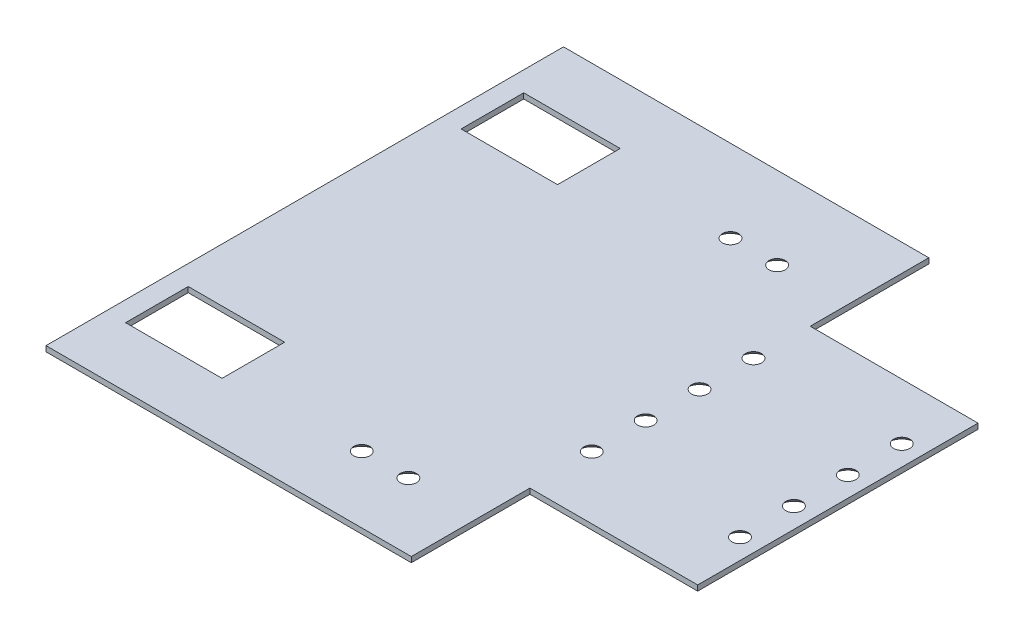
ISO-10303-21;
HEADER;
FILE_DESCRIPTION(('STEP AP214'),'2;1');
FILE_NAME('part.step','',(''),(''),'','','');
FILE_SCHEMA(('AUTOMOTIVE_DESIGN { 1 0 10303 214 1 1 1 1 }'));
ENDSEC;
DATA;
#1=APPLICATION_CONTEXT('core data for automotive mechanical design processes');
#2=APPLICATION_PROTOCOL_DEFINITION('international standard','automotive_design',2000,#1);
#3=PRODUCT_CONTEXT('',#1,'mechanical');
#4=PRODUCT('Part','Part','',(#3));
#5=PRODUCT_RELATED_PRODUCT_CATEGORY('part','',(#4));
#6=PRODUCT_DEFINITION_FORMATION('','',#4);
#7=PRODUCT_DEFINITION_CONTEXT('part definition',#1,'design');
#8=PRODUCT_DEFINITION('design','',#6,#7);
#9=PRODUCT_DEFINITION_SHAPE('','',#8);
#10=(LENGTH_UNIT() NAMED_UNIT(*) SI_UNIT(.MILLI.,.METRE.));
#11=(NAMED_UNIT(*) PLANE_ANGLE_UNIT() SI_UNIT($,.RADIAN.));
#12=(NAMED_UNIT(*) SI_UNIT($,.STERADIAN.) SOLID_ANGLE_UNIT());
#13=UNCERTAINTY_MEASURE_WITH_UNIT(LENGTH_MEASURE(1.E-05),#10,'distance_accuracy_value','');
#14=(GEOMETRIC_REPRESENTATION_CONTEXT(3) GLOBAL_UNCERTAINTY_ASSIGNED_CONTEXT((#13)) GLOBAL_UNIT_ASSIGNED_CONTEXT((#10,
#11,#12)) REPRESENTATION_CONTEXT('',''));
#15=CARTESIAN_POINT('',(0.,0.,0.));
#16=DIRECTION('',(0.,0.,1.));
#17=DIRECTION('',(1.,0.,0.));
#18=AXIS2_PLACEMENT_3D('',#15,#16,#17);
#19=CARTESIAN_POINT('',(0.,1.,0.));
#20=DIRECTION('',(0.,-1.,0.));
#21=DIRECTION('',(0.,0.,-1.));
#22=AXIS2_PLACEMENT_3D('',#19,#20,#21);
#23=PLANE('',#22);
#24=CARTESIAN_POINT('',(5.92356900920418,1.,35.6602207894241));
#25=DIRECTION('',(0.,1.,0.));
#26=DIRECTION('',(0.,0.,1.));
#27=AXIS2_PLACEMENT_3D('',#24,#25,#26);
#28=CIRCLE('',#27,1.5);
#29=CARTESIAN_POINT('',(5.92356900920418,1.,37.1602207894241));
#30=VERTEX_POINT('',#29);
#31=EDGE_CURVE('E320',#30,#30,#28,.T.);
#32=ORIENTED_EDGE('',*,*,#31,.F.);
#33=EDGE_LOOP('',(#32));
#34=FACE_BOUND('',#33,.T.);
#35=CARTESIAN_POINT('',(-2.72643099079582,1.,35.6602207894241));
#36=DIRECTION('',(0.,1.,0.));
#37=DIRECTION('',(0.,0.,1.));
#38=AXIS2_PLACEMENT_3D('',#35,#36,#37);
#39=CIRCLE('',#38,1.5);
#40=CARTESIAN_POINT('',(-2.72643099079582,1.,37.1602207894241));
#41=VERTEX_POINT('',#40);
#42=EDGE_CURVE('E322',#41,#41,#39,.T.);
#43=ORIENTED_EDGE('',*,*,#42,.F.);
#44=EDGE_LOOP('',(#43));
#45=FACE_BOUND('',#44,.T.);
#46=CARTESIAN_POINT('',(-2.72643099079582,1.,-32.7469767878305));
#47=DIRECTION('',(0.,1.,0.));
#48=DIRECTION('',(0.,0.,1.));
#49=AXIS2_PLACEMENT_3D('',#46,#47,#48);
#50=CIRCLE('',#49,1.5);
#51=CARTESIAN_POINT('',(-2.72643099079582,1.,-31.2469767878306));
#52=VERTEX_POINT('',#51);
#53=EDGE_CURVE('E325',#52,#52,#50,.T.);
#54=ORIENTED_EDGE('',*,*,#53,.F.);
#55=EDGE_LOOP('',(#54));
#56=FACE_BOUND('',#55,.T.);
#57=CARTESIAN_POINT('',(5.92356900920418,1.,-32.7469767878305));
#58=DIRECTION('',(0.,1.,0.));
#59=DIRECTION('',(0.,0.,1.));
#60=AXIS2_PLACEMENT_3D('',#57,#58,#59);
#61=CIRCLE('',#60,1.5);
#62=CARTESIAN_POINT('',(5.92356900920418,1.,-31.2469767878306));
#63=VERTEX_POINT('',#62);
#64=EDGE_CURVE('E329',#63,#63,#61,.T.);
#65=ORIENTED_EDGE('',*,*,#64,.F.);
#66=EDGE_LOOP('',(#65));
#67=FACE_BOUND('',#66,.T.);
#68=CARTESIAN_POINT('',(46.1837979810975,1.,-5.59999999995909));
#69=DIRECTION('',(0.,1.,0.));
#70=DIRECTION('',(0.,0.,1.));
#71=AXIS2_PLACEMENT_3D('',#68,#69,#70);
#72=CIRCLE('',#71,1.50000000001881);
#73=CARTESIAN_POINT('',(46.1837979810975,1.,-4.09999999994028));
#74=VERTEX_POINT('',#73);
#75=EDGE_CURVE('E339',#74,#74,#72,.T.);
#76=ORIENTED_EDGE('',*,*,#75,.F.);
#77=EDGE_LOOP('',(#76));
#78=FACE_BOUND('',#77,.T.);
#79=CARTESIAN_POINT('',(18.6837979810975,1.,4.40000000004091));
#80=DIRECTION('',(0.,1.,0.));
#81=DIRECTION('',(0.,0.,1.));
#82=AXIS2_PLACEMENT_3D('',#79,#80,#81);
#83=CIRCLE('',#82,1.50000000001833);
#84=CARTESIAN_POINT('',(18.6837979810975,1.,5.90000000005924));
#85=VERTEX_POINT('',#84);
#86=EDGE_CURVE('E342',#85,#85,#83,.T.);
#87=ORIENTED_EDGE('',*,*,#86,.F.);
#88=EDGE_LOOP('',(#87));
#89=FACE_BOUND('',#88,.T.);
#90=CARTESIAN_POINT('',(46.1837979810975,1.,4.40000000004091));
#91=DIRECTION('',(0.,1.,0.));
#92=DIRECTION('',(0.,0.,1.));
#93=AXIS2_PLACEMENT_3D('',#90,#91,#92);
#94=CIRCLE('',#93,1.50000000001881);
#95=CARTESIAN_POINT('',(46.1837979810975,1.,5.90000000005972));
#96=VERTEX_POINT('',#95);
#97=EDGE_CURVE('E345',#96,#96,#94,.T.);
#98=ORIENTED_EDGE('',*,*,#97,.F.);
#99=EDGE_LOOP('',(#98));
#100=FACE_BOUND('',#99,.T.);
#101=CARTESIAN_POINT('',(18.6837979810975,1.,14.4000000000409));
#102=DIRECTION('',(0.,1.,0.));
#103=DIRECTION('',(0.,0.,1.));
#104=AXIS2_PLACEMENT_3D('',#101,#102,#103);
#105=CIRCLE('',#104,1.50000000001833);
#106=CARTESIAN_POINT('',(18.6837979810975,1.,15.9000000000592));
#107=VERTEX_POINT('',#106);
#108=EDGE_CURVE('E348',#107,#107,#105,.T.);
#109=ORIENTED_EDGE('',*,*,#108,.F.);
#110=EDGE_LOOP('',(#109));
#111=FACE_BOUND('',#110,.T.);
#112=CARTESIAN_POINT('',(18.6837979810974,1.,-15.5999999999591));
#113=DIRECTION('',(0.,1.,0.));
#114=DIRECTION('',(0.,0.,1.));
#115=AXIS2_PLACEMENT_3D('',#112,#113,#114);
#116=CIRCLE('',#115,1.50000000001833);
#117=CARTESIAN_POINT('',(18.6837979810974,1.,-14.0999999999408));
#118=VERTEX_POINT('',#117);
#119=EDGE_CURVE('E332',#118,#118,#116,.T.);
#120=ORIENTED_EDGE('',*,*,#119,.F.);
#121=EDGE_LOOP('',(#120));
#122=FACE_BOUND('',#121,.T.);
#123=CARTESIAN_POINT('',(46.1837979810974,1.,-15.5999999999591));
#124=DIRECTION('',(0.,1.,0.));
#125=DIRECTION('',(0.,0.,1.));
#126=AXIS2_PLACEMENT_3D('',#123,#124,#125);
#127=CIRCLE('',#126,1.50000000001881);
#128=CARTESIAN_POINT('',(46.1837979810974,1.,-14.0999999999403));
#129=VERTEX_POINT('',#128);
#130=EDGE_CURVE('E335',#129,#129,#127,.T.);
#131=ORIENTED_EDGE('',*,*,#130,.F.);
#132=EDGE_LOOP('',(#131));
#133=FACE_BOUND('',#132,.T.);
#134=CARTESIAN_POINT('',(18.6837979810975,1.,-5.59999999995909));
#135=DIRECTION('',(0.,1.,0.));
#136=DIRECTION('',(0.,0.,1.));
#137=AXIS2_PLACEMENT_3D('',#134,#135,#136);
#138=CIRCLE('',#137,1.50000000001833);
#139=CARTESIAN_POINT('',(18.6837979810975,1.,-4.09999999994076));
#140=VERTEX_POINT('',#139);
#141=EDGE_CURVE('E336',#140,#140,#138,.T.);
#142=ORIENTED_EDGE('',*,*,#141,.F.);
#143=EDGE_LOOP('',(#142));
#144=FACE_BOUND('',#143,.T.);
#145=CARTESIAN_POINT('',(46.1837979810975,1.,14.4000000000409));
#146=DIRECTION('',(0.,1.,0.));
#147=DIRECTION('',(0.,0.,1.));
#148=AXIS2_PLACEMENT_3D('',#145,#146,#147);
#149=CIRCLE('',#148,1.50000000001881);
#150=CARTESIAN_POINT('',(46.1837979810975,1.,15.9000000000597));
#151=VERTEX_POINT('',#150);
#152=EDGE_CURVE('E179',#151,#151,#149,.T.);
#153=ORIENTED_EDGE('',*,*,#152,.F.);
#154=EDGE_LOOP('',(#153));
#155=FACE_BOUND('',#154,.T.);
#156=DIRECTION('',(0.,0.,1.));
#157=VECTOR('',#156,1.);
#158=CARTESIAN_POINT('',(-45.2655887180152,1.,-36.9305061843001));
#159=LINE('',#158,#157);
#160=CARTESIAN_POINT('',(-45.2655887180152,1.,-36.9305061843001));
#161=VERTEX_POINT('',#160);
#162=CARTESIAN_POINT('',(-45.2655887180152,1.,-25.3095235954431));
#163=VERTEX_POINT('',#162);
#164=EDGE_CURVE('E189',#161,#163,#159,.T.);
#165=ORIENTED_EDGE('',*,*,#164,.F.);
#166=DIRECTION('',(-1.,0.,0.));
#167=VECTOR('',#166,1.);
#168=CARTESIAN_POINT('',(-45.2655887180152,1.,-36.9305061843001));
#169=LINE('',#168,#167);
#170=CARTESIAN_POINT('',(-27.3725872945403,1.,-36.9305061843001));
#171=VERTEX_POINT('',#170);
#172=EDGE_CURVE('E197',#171,#161,#169,.T.);
#173=ORIENTED_EDGE('',*,*,#172,.F.);
#174=DIRECTION('',(0.,0.,-1.));
#175=VECTOR('',#174,1.);
#176=CARTESIAN_POINT('',(-27.3725872945403,1.,-36.9305061843001));
#177=LINE('',#176,#175);
#178=CARTESIAN_POINT('',(-27.3725872945403,1.,-25.3095235954431));
#179=VERTEX_POINT('',#178);
#180=EDGE_CURVE('E194',#179,#171,#177,.T.);
#181=ORIENTED_EDGE('',*,*,#180,.F.);
#182=DIRECTION('',(1.,0.,0.));
#183=VECTOR('',#182,1.);
#184=CARTESIAN_POINT('',(-45.2655887180152,1.,-25.3095235954431));
#185=LINE('',#184,#183);
#186=EDGE_CURVE('E191',#163,#179,#185,.T.);
#187=ORIENTED_EDGE('',*,*,#186,.F.);
#188=EDGE_LOOP('',(#165,#173,#181,#187));
#189=FACE_BOUND('',#188,.T.);
#190=DIRECTION('',(1.,0.,1.61649475190916E-13));
#191=VECTOR('',#190,1.);
#192=CARTESIAN_POINT('',(-48.9590812442226,1.,48.000000000031));
#193=LINE('',#192,#191);
#194=CARTESIAN_POINT('',(-48.9590812442226,1.,48.000000000031));
#195=VERTEX_POINT('',#194);
#196=CARTESIAN_POINT('',(18.8099324408469,1.,48.0000000000413));
#197=VERTEX_POINT('',#196);
#198=EDGE_CURVE('E220',#195,#197,#193,.T.);
#199=ORIENTED_EDGE('',*,*,#198,.T.);
#200=DIRECTION('',(0.,0.,-1.));
#201=VECTOR('',#200,1.);
#202=CARTESIAN_POINT('',(18.8099324408469,1.,26.000000000031));
#203=LINE('',#202,#201);
#204=CARTESIAN_POINT('',(18.8099324408469,1.,26.000000000031));
#205=VERTEX_POINT('',#204);
#206=EDGE_CURVE('E222',#197,#205,#203,.T.);
#207=ORIENTED_EDGE('',*,*,#206,.T.);
#208=DIRECTION('',(1.,0.,0.));
#209=VECTOR('',#208,1.);
#210=CARTESIAN_POINT('',(49.9337979810974,1.,26.000000000031));
#211=LINE('',#210,#209);
#212=CARTESIAN_POINT('',(49.9337979810974,1.,26.000000000031));
#213=VERTEX_POINT('',#212);
#214=EDGE_CURVE('E225',#205,#213,#211,.T.);
#215=ORIENTED_EDGE('',*,*,#214,.T.);
#216=DIRECTION('',(0.,0.,-1.));
#217=VECTOR('',#216,1.);
#218=CARTESIAN_POINT('',(49.9337979810974,1.,-25.9999999999587));
#219=LINE('',#218,#217);
#220=CARTESIAN_POINT('',(49.9337979810974,1.,-25.9999999999587));
#221=VERTEX_POINT('',#220);
#222=EDGE_CURVE('E227',#213,#221,#219,.T.);
#223=ORIENTED_EDGE('',*,*,#222,.T.);
#224=DIRECTION('',(-1.,0.,0.));
#225=VECTOR('',#224,1.);
#226=CARTESIAN_POINT('',(49.9337979810974,1.,-25.9999999999587));
#227=LINE('',#226,#225);
#228=CARTESIAN_POINT('',(18.8099324408469,1.,-25.9999999999587));
#229=VERTEX_POINT('',#228);
#230=EDGE_CURVE('E229',#221,#229,#227,.T.);
#231=ORIENTED_EDGE('',*,*,#230,.T.);
#232=DIRECTION('',(0.,0.,-1.));
#233=VECTOR('',#232,1.);
#234=CARTESIAN_POINT('',(18.8099324408469,1.,-25.9999999999587));
#235=LINE('',#234,#233);
#236=CARTESIAN_POINT('',(18.8099324408469,1.,-47.999999999969));
#237=VERTEX_POINT('',#236);
#238=EDGE_CURVE('E231',#229,#237,#235,.T.);
#239=ORIENTED_EDGE('',*,*,#238,.T.);
#240=DIRECTION('',(-1.,0.,0.));
#241=VECTOR('',#240,1.);
#242=CARTESIAN_POINT('',(15.,1.,-47.999999999969));
#243=LINE('',#242,#241);
#244=CARTESIAN_POINT('',(-48.9590812442226,1.,-47.9999999999586));
#245=VERTEX_POINT('',#244);
#246=EDGE_CURVE('E233',#237,#245,#243,.T.);
#247=ORIENTED_EDGE('',*,*,#246,.T.);
#248=DIRECTION('',(0.,0.,1.));
#249=VECTOR('',#248,1.);
#250=CARTESIAN_POINT('',(-48.9590812442226,1.,-47.9999999999586));
#251=LINE('',#250,#249);
#252=EDGE_CURVE('E235',#245,#195,#251,.T.);
#253=ORIENTED_EDGE('',*,*,#252,.T.);
#254=EDGE_LOOP('',(#199,#207,#215,#223,#231,#239,#247,#253));
#255=FACE_BOUND('',#254,.T.);
#256=DIRECTION('',(1.,0.,0.));
#257=VECTOR('',#256,1.);
#258=CARTESIAN_POINT('',(-45.2655887180152,1.,36.9305061843724));
#259=LINE('',#258,#257);
#260=CARTESIAN_POINT('',(-45.2655887180152,1.,36.9305061843724));
#261=VERTEX_POINT('',#260);
#262=CARTESIAN_POINT('',(-27.3725872945403,1.,36.9305061843724));
#263=VERTEX_POINT('',#262);
#264=EDGE_CURVE('E151',#261,#263,#259,.T.);
#265=ORIENTED_EDGE('',*,*,#264,.F.);
#266=DIRECTION('',(0.,0.,1.));
#267=VECTOR('',#266,1.);
#268=CARTESIAN_POINT('',(-45.2655887180152,1.,36.9305061843724));
#269=LINE('',#268,#267);
#270=CARTESIAN_POINT('',(-45.2655887180152,1.,25.3095235955155));
#271=VERTEX_POINT('',#270);
#272=EDGE_CURVE('E173',#271,#261,#269,.T.);
#273=ORIENTED_EDGE('',*,*,#272,.F.);
#274=DIRECTION('',(-1.,0.,0.));
#275=VECTOR('',#274,1.);
#276=CARTESIAN_POINT('',(-45.2655887180152,1.,25.3095235955155));
#277=LINE('',#276,#275);
#278=CARTESIAN_POINT('',(-27.3725872945403,1.,25.3095235955155));
#279=VERTEX_POINT('',#278);
#280=EDGE_CURVE('E171',#279,#271,#277,.T.);
#281=ORIENTED_EDGE('',*,*,#280,.F.);
#282=DIRECTION('',(0.,0.,-1.));
#283=VECTOR('',#282,1.);
#284=CARTESIAN_POINT('',(-27.3725872945403,1.,36.9305061843724));
#285=LINE('',#284,#283);
#286=EDGE_CURVE('E159',#263,#279,#285,.T.);
#287=ORIENTED_EDGE('',*,*,#286,.F.);
#288=EDGE_LOOP('',(#265,#273,#281,#287));
#289=FACE_BOUND('',#288,.T.);
#290=ADVANCED_FACE('F37',(#34,#45,#56,#67,#78,#89,#100,#111,#122,#133,#144,#155,#189,#255,#289),
#23,.F.);
#291=CARTESIAN_POINT('',(0.,0.,0.));
#292=DIRECTION('',(0.,-1.,0.));
#293=DIRECTION('',(0.,0.,-1.));
#294=AXIS2_PLACEMENT_3D('',#291,#292,#293);
#295=PLANE('',#294);
#296=CARTESIAN_POINT('',(-2.72643099079582,0.,35.6602207894241));
#297=DIRECTION('',(0.,-1.,0.));
#298=DIRECTION('',(0.,0.,-1.));
#299=AXIS2_PLACEMENT_3D('',#296,#297,#298);
#300=CIRCLE('',#299,2.50000000000002);
#301=CARTESIAN_POINT('',(-2.72643099079582,0.,33.1602207894241));
#302=VERTEX_POINT('',#301);
#303=EDGE_CURVE('E11',#302,#302,#300,.F.);
#304=ORIENTED_EDGE('',*,*,#303,.T.);
#305=EDGE_LOOP('',(#304));
#306=FACE_BOUND('',#305,.T.);
#307=CARTESIAN_POINT('',(5.92356900920418,0.,35.6602207894241));
#308=DIRECTION('',(0.,-1.,0.));
#309=DIRECTION('',(0.,0.,-1.));
#310=AXIS2_PLACEMENT_3D('',#307,#308,#309);
#311=CIRCLE('',#310,2.50000000000002);
#312=CARTESIAN_POINT('',(5.92356900920418,0.,33.1602207894241));
#313=VERTEX_POINT('',#312);
#314=EDGE_CURVE('E46',#313,#313,#311,.F.);
#315=ORIENTED_EDGE('',*,*,#314,.T.);
#316=EDGE_LOOP('',(#315));
#317=FACE_BOUND('',#316,.T.);
#318=CARTESIAN_POINT('',(-2.72643099079582,0.,-32.7469767878305));
#319=DIRECTION('',(0.,-1.,0.));
#320=DIRECTION('',(0.,0.,-1.));
#321=AXIS2_PLACEMENT_3D('',#318,#319,#320);
#322=CIRCLE('',#321,2.50000000000002);
#323=CARTESIAN_POINT('',(-2.72643099079582,0.,-35.2469767878306));
#324=VERTEX_POINT('',#323);
#325=EDGE_CURVE('E304',#324,#324,#322,.F.);
#326=ORIENTED_EDGE('',*,*,#325,.T.);
#327=EDGE_LOOP('',(#326));
#328=FACE_BOUND('',#327,.T.);
#329=CARTESIAN_POINT('',(5.92356900920418,0.,-32.7469767878305));
#330=DIRECTION('',(0.,-1.,0.));
#331=DIRECTION('',(0.,0.,-1.));
#332=AXIS2_PLACEMENT_3D('',#329,#330,#331);
#333=CIRCLE('',#332,2.50000000000002);
#334=CARTESIAN_POINT('',(5.92356900920418,0.,-35.2469767878306));
#335=VERTEX_POINT('',#334);
#336=EDGE_CURVE('E301',#335,#335,#333,.F.);
#337=ORIENTED_EDGE('',*,*,#336,.T.);
#338=EDGE_LOOP('',(#337));
#339=FACE_BOUND('',#338,.T.);
#340=CARTESIAN_POINT('',(18.6837979810974,0.,-15.5999999999591));
#341=DIRECTION('',(0.,-1.,0.));
#342=DIRECTION('',(0.,0.,-1.));
#343=AXIS2_PLACEMENT_3D('',#340,#341,#342);
#344=CIRCLE('',#343,2.50000000001835);
#345=CARTESIAN_POINT('',(18.6837979810974,0.,-18.0999999999774));
#346=VERTEX_POINT('',#345);
#347=EDGE_CURVE('E298',#346,#346,#344,.F.);
#348=ORIENTED_EDGE('',*,*,#347,.T.);
#349=EDGE_LOOP('',(#348));
#350=FACE_BOUND('',#349,.T.);
#351=CARTESIAN_POINT('',(18.6837979810975,0.,-5.59999999995909));
#352=DIRECTION('',(0.,-1.,0.));
#353=DIRECTION('',(0.,0.,-1.));
#354=AXIS2_PLACEMENT_3D('',#351,#352,#353);
#355=CIRCLE('',#354,2.50000000001835);
#356=CARTESIAN_POINT('',(18.6837979810975,0.,-8.09999999997744));
#357=VERTEX_POINT('',#356);
#358=EDGE_CURVE('E295',#357,#357,#355,.F.);
#359=ORIENTED_EDGE('',*,*,#358,.T.);
#360=EDGE_LOOP('',(#359));
#361=FACE_BOUND('',#360,.T.);
#362=CARTESIAN_POINT('',(18.6837979810975,0.,4.40000000004091));
#363=DIRECTION('',(0.,-1.,0.));
#364=DIRECTION('',(0.,0.,-1.));
#365=AXIS2_PLACEMENT_3D('',#362,#363,#364);
#366=CIRCLE('',#365,2.50000000001835);
#367=CARTESIAN_POINT('',(18.6837979810975,0.,1.90000000002256));
#368=VERTEX_POINT('',#367);
#369=EDGE_CURVE('E292',#368,#368,#366,.F.);
#370=ORIENTED_EDGE('',*,*,#369,.T.);
#371=EDGE_LOOP('',(#370));
#372=FACE_BOUND('',#371,.T.);
#373=CARTESIAN_POINT('',(18.6837979810975,0.,14.4000000000409));
#374=DIRECTION('',(0.,-1.,0.));
#375=DIRECTION('',(0.,0.,-1.));
#376=AXIS2_PLACEMENT_3D('',#373,#374,#375);
#377=CIRCLE('',#376,2.50000000001835);
#378=CARTESIAN_POINT('',(18.6837979810975,0.,11.9000000000226));
#379=VERTEX_POINT('',#378);
#380=EDGE_CURVE('E289',#379,#379,#377,.F.);
#381=ORIENTED_EDGE('',*,*,#380,.T.);
#382=EDGE_LOOP('',(#381));
#383=FACE_BOUND('',#382,.T.);
#384=CARTESIAN_POINT('',(46.1837979810974,0.,-15.5999999999591));
#385=DIRECTION('',(0.,-1.,0.));
#386=DIRECTION('',(0.,0.,-1.));
#387=AXIS2_PLACEMENT_3D('',#384,#385,#386);
#388=CIRCLE('',#387,2.50000000001882);
#389=CARTESIAN_POINT('',(46.1837979810974,0.,-18.0999999999779));
#390=VERTEX_POINT('',#389);
#391=EDGE_CURVE('E286',#390,#390,#388,.F.);
#392=ORIENTED_EDGE('',*,*,#391,.T.);
#393=EDGE_LOOP('',(#392));
#394=FACE_BOUND('',#393,.T.);
#395=CARTESIAN_POINT('',(46.1837979810975,0.,-5.59999999995909));
#396=DIRECTION('',(0.,-1.,0.));
#397=DIRECTION('',(0.,0.,-1.));
#398=AXIS2_PLACEMENT_3D('',#395,#396,#397);
#399=CIRCLE('',#398,2.50000000001883);
#400=CARTESIAN_POINT('',(46.1837979810975,0.,-8.09999999997792));
#401=VERTEX_POINT('',#400);
#402=EDGE_CURVE('E283',#401,#401,#399,.F.);
#403=ORIENTED_EDGE('',*,*,#402,.T.);
#404=EDGE_LOOP('',(#403));
#405=FACE_BOUND('',#404,.T.);
#406=CARTESIAN_POINT('',(46.1837979810975,0.,4.40000000004091));
#407=DIRECTION('',(0.,-1.,0.));
#408=DIRECTION('',(0.,0.,-1.));
#409=AXIS2_PLACEMENT_3D('',#406,#407,#408);
#410=CIRCLE('',#409,2.50000000001882);
#411=CARTESIAN_POINT('',(46.1837979810975,0.,1.90000000002208));
#412=VERTEX_POINT('',#411);
#413=EDGE_CURVE('E280',#412,#412,#410,.F.);
#414=ORIENTED_EDGE('',*,*,#413,.T.);
#415=EDGE_LOOP('',(#414));
#416=FACE_BOUND('',#415,.T.);
#417=CARTESIAN_POINT('',(46.1837979810975,0.,14.4000000000409));
#418=DIRECTION('',(0.,-1.,0.));
#419=DIRECTION('',(0.,0.,-1.));
#420=AXIS2_PLACEMENT_3D('',#417,#418,#419);
#421=CIRCLE('',#420,2.50000000001882);
#422=CARTESIAN_POINT('',(46.1837979810975,0.,11.9000000000221));
#423=VERTEX_POINT('',#422);
#424=EDGE_CURVE('E277',#423,#423,#421,.F.);
#425=ORIENTED_EDGE('',*,*,#424,.T.);
#426=EDGE_LOOP('',(#425));
#427=FACE_BOUND('',#426,.T.);
#428=DIRECTION('',(1.,0.,0.));
#429=VECTOR('',#428,1.);
#430=CARTESIAN_POINT('',(15.,0.,48.0000000000413));
#431=LINE('',#430,#429);
#432=CARTESIAN_POINT('',(-48.9590812442226,0.,48.000000000031));
#433=VERTEX_POINT('',#432);
#434=CARTESIAN_POINT('',(18.8099324408469,0.,48.0000000000413));
#435=VERTEX_POINT('',#434);
#436=EDGE_CURVE('E219',#433,#435,#431,.T.);
#437=ORIENTED_EDGE('',*,*,#436,.F.);
#438=DIRECTION('',(0.,0.,1.));
#439=VECTOR('',#438,1.);
#440=CARTESIAN_POINT('',(-48.9590812442226,0.,-47.9999999999586));
#441=LINE('',#440,#439);
#442=CARTESIAN_POINT('',(-48.9590812442226,0.,-47.9999999999586));
#443=VERTEX_POINT('',#442);
#444=EDGE_CURVE('E223',#443,#433,#441,.T.);
#445=ORIENTED_EDGE('',*,*,#444,.F.);
#446=DIRECTION('',(-1.,0.,1.61866454352247E-13));
#447=VECTOR('',#446,1.);
#448=CARTESIAN_POINT('',(-48.9590812442226,0.,-47.9999999999586));
#449=LINE('',#448,#447);
#450=CARTESIAN_POINT('',(18.8099324408469,0.,-47.999999999969));
#451=VERTEX_POINT('',#450);
#452=EDGE_CURVE('E250',#451,#443,#449,.T.);
#453=ORIENTED_EDGE('',*,*,#452,.F.);
#454=DIRECTION('',(0.,0.,-1.));
#455=VECTOR('',#454,1.);
#456=CARTESIAN_POINT('',(18.8099324408469,0.,-25.9999999999587));
#457=LINE('',#456,#455);
#458=CARTESIAN_POINT('',(18.8099324408469,0.,-25.9999999999587));
#459=VERTEX_POINT('',#458);
#460=EDGE_CURVE('E247',#459,#451,#457,.T.);
#461=ORIENTED_EDGE('',*,*,#460,.F.);
#462=DIRECTION('',(-1.,0.,0.));
#463=VECTOR('',#462,1.);
#464=CARTESIAN_POINT('',(49.9337979810974,0.,-25.9999999999587));
#465=LINE('',#464,#463);
#466=CARTESIAN_POINT('',(49.9337979810974,0.,-25.9999999999587));
#467=VERTEX_POINT('',#466);
#468=EDGE_CURVE('E245',#467,#459,#465,.T.);
#469=ORIENTED_EDGE('',*,*,#468,.F.);
#470=DIRECTION('',(0.,0.,-1.));
#471=VECTOR('',#470,1.);
#472=CARTESIAN_POINT('',(49.9337979810974,0.,-25.9999999999587));
#473=LINE('',#472,#471);
#474=CARTESIAN_POINT('',(49.9337979810974,0.,26.000000000031));
#475=VERTEX_POINT('',#474);
#476=EDGE_CURVE('E243',#475,#467,#473,.T.);
#477=ORIENTED_EDGE('',*,*,#476,.F.);
#478=DIRECTION('',(1.,0.,0.));
#479=VECTOR('',#478,1.);
#480=CARTESIAN_POINT('',(49.9337979810974,0.,26.000000000031));
#481=LINE('',#480,#479);
#482=CARTESIAN_POINT('',(18.8099324408469,0.,26.000000000031));
#483=VERTEX_POINT('',#482);
#484=EDGE_CURVE('E241',#483,#475,#481,.T.);
#485=ORIENTED_EDGE('',*,*,#484,.F.);
#486=DIRECTION('',(0.,0.,-1.));
#487=VECTOR('',#486,1.);
#488=CARTESIAN_POINT('',(18.8099324408469,0.,26.000000000031));
#489=LINE('',#488,#487);
#490=EDGE_CURVE('E239',#435,#483,#489,.T.);
#491=ORIENTED_EDGE('',*,*,#490,.F.);
#492=EDGE_LOOP('',(#437,#445,#453,#461,#469,#477,#485,#491));
#493=FACE_BOUND('',#492,.T.);
#494=DIRECTION('',(-1.,0.,0.));
#495=VECTOR('',#494,1.);
#496=CARTESIAN_POINT('',(-45.2655887180152,0.,-36.9305061843001));
#497=LINE('',#496,#495);
#498=CARTESIAN_POINT('',(-27.3725872945403,0.,-36.9305061843001));
#499=VERTEX_POINT('',#498);
#500=CARTESIAN_POINT('',(-45.2655887180152,0.,-36.9305061843001));
#501=VERTEX_POINT('',#500);
#502=EDGE_CURVE('E192',#499,#501,#497,.T.);
#503=ORIENTED_EDGE('',*,*,#502,.T.);
#504=DIRECTION('',(0.,0.,1.));
#505=VECTOR('',#504,1.);
#506=CARTESIAN_POINT('',(-45.2655887180152,0.,-36.9305061843001));
#507=LINE('',#506,#505);
#508=CARTESIAN_POINT('',(-45.2655887180152,0.,-25.3095235954431));
#509=VERTEX_POINT('',#508);
#510=EDGE_CURVE('E167',#501,#509,#507,.T.);
#511=ORIENTED_EDGE('',*,*,#510,.T.);
#512=DIRECTION('',(1.,0.,0.));
#513=VECTOR('',#512,1.);
#514=CARTESIAN_POINT('',(-45.2655887180152,0.,-25.3095235954431));
#515=LINE('',#514,#513);
#516=CARTESIAN_POINT('',(-27.3725872945403,0.,-25.3095235954431));
#517=VERTEX_POINT('',#516);
#518=EDGE_CURVE('E202',#509,#517,#515,.T.);
#519=ORIENTED_EDGE('',*,*,#518,.T.);
#520=DIRECTION('',(0.,0.,-1.));
#521=VECTOR('',#520,1.);
#522=CARTESIAN_POINT('',(-27.3725872945403,0.,-36.9305061843001));
#523=LINE('',#522,#521);
#524=EDGE_CURVE('E205',#517,#499,#523,.T.);
#525=ORIENTED_EDGE('',*,*,#524,.T.);
#526=EDGE_LOOP('',(#503,#511,#519,#525));
#527=FACE_BOUND('',#526,.T.);
#528=DIRECTION('',(0.,0.,1.));
#529=VECTOR('',#528,1.);
#530=CARTESIAN_POINT('',(-45.2655887180152,0.,36.9305061843724));
#531=LINE('',#530,#529);
#532=CARTESIAN_POINT('',(-45.2655887180152,0.,25.3095235955155));
#533=VERTEX_POINT('',#532);
#534=CARTESIAN_POINT('',(-45.2655887180152,0.,36.9305061843724));
#535=VERTEX_POINT('',#534);
#536=EDGE_CURVE('E160',#533,#535,#531,.T.);
#537=ORIENTED_EDGE('',*,*,#536,.T.);
#538=DIRECTION('',(1.,0.,0.));
#539=VECTOR('',#538,1.);
#540=CARTESIAN_POINT('',(-45.2655887180152,0.,36.9305061843724));
#541=LINE('',#540,#539);
#542=CARTESIAN_POINT('',(-27.3725872945403,0.,36.9305061843724));
#543=VERTEX_POINT('',#542);
#544=EDGE_CURVE('E61',#535,#543,#541,.T.);
#545=ORIENTED_EDGE('',*,*,#544,.T.);
#546=DIRECTION('',(0.,0.,-1.));
#547=VECTOR('',#546,1.);
#548=CARTESIAN_POINT('',(-27.3725872945403,0.,36.9305061843724));
#549=LINE('',#548,#547);
#550=CARTESIAN_POINT('',(-27.3725872945403,0.,25.3095235955155));
#551=VERTEX_POINT('',#550);
#552=EDGE_CURVE('E166',#543,#551,#549,.T.);
#553=ORIENTED_EDGE('',*,*,#552,.T.);
#554=DIRECTION('',(-1.,0.,0.));
#555=VECTOR('',#554,1.);
#556=CARTESIAN_POINT('',(-45.2655887180152,0.,25.3095235955155));
#557=LINE('',#556,#555);
#558=EDGE_CURVE('E181',#551,#533,#557,.T.);
#559=ORIENTED_EDGE('',*,*,#558,.T.);
#560=EDGE_LOOP('',(#537,#545,#553,#559));
#561=FACE_BOUND('',#560,.T.);
#562=ADVANCED_FACE('F309',(#306,#317,#328,#339,#350,#361,#372,#383,#394,#405,#416,#427,#493,
#527,#561),#295,.T.);
#563=CARTESIAN_POINT('',(15.,1.,48.0000000000413));
#564=DIRECTION('',(0.,0.,-1.));
#565=DIRECTION('',(-1.,0.,0.));
#566=AXIS2_PLACEMENT_3D('',#563,#564,#565);
#567=PLANE('',#566);
#568=ORIENTED_EDGE('',*,*,#436,.T.);
#569=DIRECTION('',(0.,-1.,0.));
#570=VECTOR('',#569,1.);
#571=CARTESIAN_POINT('',(18.8099324408469,1.,48.0000000000413));
#572=LINE('',#571,#570);
#573=EDGE_CURVE('E274',#197,#435,#572,.T.);
#574=ORIENTED_EDGE('',*,*,#573,.F.);
#575=ORIENTED_EDGE('',*,*,#198,.F.);
#576=DIRECTION('',(0.,-1.,0.));
#577=VECTOR('',#576,1.);
#578=CARTESIAN_POINT('',(-48.9590812442226,1.,48.000000000031));
#579=LINE('',#578,#577);
#580=EDGE_CURVE('E237',#195,#433,#579,.T.);
#581=ORIENTED_EDGE('',*,*,#580,.T.);
#582=EDGE_LOOP('',(#568,#574,#575,#581));
#583=FACE_BOUND('',#582,.T.);
#584=ADVANCED_FACE('F371',(#583),#567,.F.);
#585=CARTESIAN_POINT('',(18.8099324408469,1.,26.000000000031));
#586=DIRECTION('',(-1.,0.,0.));
#587=DIRECTION('',(0.,0.,1.));
#588=AXIS2_PLACEMENT_3D('',#585,#586,#587);
#589=PLANE('',#588);
#590=ORIENTED_EDGE('',*,*,#490,.T.);
#591=DIRECTION('',(0.,-1.,0.));
#592=VECTOR('',#591,1.);
#593=CARTESIAN_POINT('',(18.8099324408469,1.,26.000000000031));
#594=LINE('',#593,#592);
#595=EDGE_CURVE('E271',#205,#483,#594,.T.);
#596=ORIENTED_EDGE('',*,*,#595,.F.);
#597=ORIENTED_EDGE('',*,*,#206,.F.);
#598=ORIENTED_EDGE('',*,*,#573,.T.);
#599=EDGE_LOOP('',(#590,#596,#597,#598));
#600=FACE_BOUND('',#599,.T.);
#601=ADVANCED_FACE('F374',(#600),#589,.F.);
#602=CARTESIAN_POINT('',(49.9337979810974,1.,26.000000000031));
#603=DIRECTION('',(0.,0.,-1.));
#604=DIRECTION('',(-1.,0.,0.));
#605=AXIS2_PLACEMENT_3D('',#602,#603,#604);
#606=PLANE('',#605);
#607=ORIENTED_EDGE('',*,*,#484,.T.);
#608=DIRECTION('',(0.,-1.,0.));
#609=VECTOR('',#608,1.);
#610=CARTESIAN_POINT('',(49.9337979810974,1.,26.000000000031));
#611=LINE('',#610,#609);
#612=EDGE_CURVE('E268',#213,#475,#611,.T.);
#613=ORIENTED_EDGE('',*,*,#612,.F.);
#614=ORIENTED_EDGE('',*,*,#214,.F.);
#615=ORIENTED_EDGE('',*,*,#595,.T.);
#616=EDGE_LOOP('',(#607,#613,#614,#615));
#617=FACE_BOUND('',#616,.T.);
#618=ADVANCED_FACE('F379',(#617),#606,.F.);
#619=CARTESIAN_POINT('',(49.9337979810974,1.,-25.9999999999587));
#620=DIRECTION('',(-1.,0.,0.));
#621=DIRECTION('',(0.,0.,1.));
#622=AXIS2_PLACEMENT_3D('',#619,#620,#621);
#623=PLANE('',#622);
#624=ORIENTED_EDGE('',*,*,#476,.T.);
#625=DIRECTION('',(0.,-1.,0.));
#626=VECTOR('',#625,1.);
#627=CARTESIAN_POINT('',(49.9337979810974,1.,-25.9999999999587));
#628=LINE('',#627,#626);
#629=EDGE_CURVE('E265',#221,#467,#628,.T.);
#630=ORIENTED_EDGE('',*,*,#629,.F.);
#631=ORIENTED_EDGE('',*,*,#222,.F.);
#632=ORIENTED_EDGE('',*,*,#612,.T.);
#633=EDGE_LOOP('',(#624,#630,#631,#632));
#634=FACE_BOUND('',#633,.T.);
#635=ADVANCED_FACE('F385',(#634),#623,.F.);
#636=CARTESIAN_POINT('',(49.9337979810974,1.,-25.9999999999587));
#637=DIRECTION('',(0.,0.,1.));
#638=DIRECTION('',(1.,0.,0.));
#639=AXIS2_PLACEMENT_3D('',#636,#637,#638);
#640=PLANE('',#639);
#641=ORIENTED_EDGE('',*,*,#468,.T.);
#642=DIRECTION('',(0.,-1.,0.));
#643=VECTOR('',#642,1.);
#644=CARTESIAN_POINT('',(18.8099324408469,1.,-25.9999999999587));
#645=LINE('',#644,#643);
#646=EDGE_CURVE('E262',#229,#459,#645,.T.);
#647=ORIENTED_EDGE('',*,*,#646,.F.);
#648=ORIENTED_EDGE('',*,*,#230,.F.);
#649=ORIENTED_EDGE('',*,*,#629,.T.);
#650=EDGE_LOOP('',(#641,#647,#648,#649));
#651=FACE_BOUND('',#650,.T.);
#652=ADVANCED_FACE('F389',(#651),#640,.F.);
#653=CARTESIAN_POINT('',(18.8099324408469,1.,-25.9999999999587));
#654=DIRECTION('',(-1.,0.,0.));
#655=DIRECTION('',(0.,0.,1.));
#656=AXIS2_PLACEMENT_3D('',#653,#654,#655);
#657=PLANE('',#656);
#658=ORIENTED_EDGE('',*,*,#460,.T.);
#659=DIRECTION('',(0.,-1.,0.));
#660=VECTOR('',#659,1.);
#661=CARTESIAN_POINT('',(18.8099324408469,1.,-47.999999999969));
#662=LINE('',#661,#660);
#663=EDGE_CURVE('E259',#237,#451,#662,.T.);
#664=ORIENTED_EDGE('',*,*,#663,.F.);
#665=ORIENTED_EDGE('',*,*,#238,.F.);
#666=ORIENTED_EDGE('',*,*,#646,.T.);
#667=EDGE_LOOP('',(#658,#664,#665,#666));
#668=FACE_BOUND('',#667,.T.);
#669=ADVANCED_FACE('F394',(#668),#657,.F.);
#670=CARTESIAN_POINT('',(-48.9590812442226,1.,-47.9999999999586));
#671=DIRECTION('',(1.61866454352247E-13,0.,1.));
#672=DIRECTION('',(1.,0.,-1.61866454352247E-13));
#673=AXIS2_PLACEMENT_3D('',#670,#671,#672);
#674=PLANE('',#673);
#675=ORIENTED_EDGE('',*,*,#452,.T.);
#676=DIRECTION('',(0.,-1.,0.));
#677=VECTOR('',#676,1.);
#678=CARTESIAN_POINT('',(-48.9590812442226,1.,-47.9999999999586));
#679=LINE('',#678,#677);
#680=EDGE_CURVE('E256',#245,#443,#679,.T.);
#681=ORIENTED_EDGE('',*,*,#680,.F.);
#682=ORIENTED_EDGE('',*,*,#246,.F.);
#683=ORIENTED_EDGE('',*,*,#663,.T.);
#684=EDGE_LOOP('',(#675,#681,#682,#683));
#685=FACE_BOUND('',#684,.T.);
#686=ADVANCED_FACE('F398',(#685),#674,.F.);
#687=CARTESIAN_POINT('',(-48.9590812442226,1.,-47.9999999999586));
#688=DIRECTION('',(1.,0.,0.));
#689=DIRECTION('',(0.,0.,-1.));
#690=AXIS2_PLACEMENT_3D('',#687,#688,#689);
#691=PLANE('',#690);
#692=ORIENTED_EDGE('',*,*,#444,.T.);
#693=ORIENTED_EDGE('',*,*,#580,.F.);
#694=ORIENTED_EDGE('',*,*,#252,.F.);
#695=ORIENTED_EDGE('',*,*,#680,.T.);
#696=EDGE_LOOP('',(#692,#693,#694,#695));
#697=FACE_BOUND('',#696,.T.);
#698=ADVANCED_FACE('F401',(#697),#691,.F.);
#699=CARTESIAN_POINT('',(-45.2655887180152,1.,-36.9305061843001));
#700=DIRECTION('',(1.,0.,0.));
#701=DIRECTION('',(0.,0.,-1.));
#702=AXIS2_PLACEMENT_3D('',#699,#700,#701);
#703=PLANE('',#702);
#704=ORIENTED_EDGE('',*,*,#510,.F.);
#705=DIRECTION('',(0.,-1.,0.));
#706=VECTOR('',#705,1.);
#707=CARTESIAN_POINT('',(-45.2655887180152,1.,-36.9305061843001));
#708=LINE('',#707,#706);
#709=EDGE_CURVE('E199',#161,#501,#708,.T.);
#710=ORIENTED_EDGE('',*,*,#709,.F.);
#711=ORIENTED_EDGE('',*,*,#164,.T.);
#712=DIRECTION('',(0.,-1.,0.));
#713=VECTOR('',#712,1.);
#714=CARTESIAN_POINT('',(-45.2655887180152,1.,-25.3095235954431));
#715=LINE('',#714,#713);
#716=EDGE_CURVE('E216',#163,#509,#715,.T.);
#717=ORIENTED_EDGE('',*,*,#716,.T.);
#718=EDGE_LOOP('',(#704,#710,#711,#717));
#719=FACE_BOUND('',#718,.T.);
#720=ADVANCED_FACE('F440',(#719),#703,.T.);
#721=CARTESIAN_POINT('',(-45.2655887180152,1.,-25.3095235954431));
#722=DIRECTION('',(0.,0.,-1.));
#723=DIRECTION('',(-1.,0.,0.));
#724=AXIS2_PLACEMENT_3D('',#721,#722,#723);
#725=PLANE('',#724);
#726=ORIENTED_EDGE('',*,*,#518,.F.);
#727=ORIENTED_EDGE('',*,*,#716,.F.);
#728=ORIENTED_EDGE('',*,*,#186,.T.);
#729=DIRECTION('',(0.,-1.,0.));
#730=VECTOR('',#729,1.);
#731=CARTESIAN_POINT('',(-27.3725872945403,1.,-25.3095235954431));
#732=LINE('',#731,#730);
#733=EDGE_CURVE('E214',#179,#517,#732,.T.);
#734=ORIENTED_EDGE('',*,*,#733,.T.);
#735=EDGE_LOOP('',(#726,#727,#728,#734));
#736=FACE_BOUND('',#735,.T.);
#737=ADVANCED_FACE('F436',(#736),#725,.T.);
#738=CARTESIAN_POINT('',(-27.3725872945403,1.,-36.9305061843001));
#739=DIRECTION('',(-1.,0.,0.));
#740=DIRECTION('',(0.,0.,1.));
#741=AXIS2_PLACEMENT_3D('',#738,#739,#740);
#742=PLANE('',#741);
#743=ORIENTED_EDGE('',*,*,#524,.F.);
#744=ORIENTED_EDGE('',*,*,#733,.F.);
#745=ORIENTED_EDGE('',*,*,#180,.T.);
#746=DIRECTION('',(0.,-1.,0.));
#747=VECTOR('',#746,1.);
#748=CARTESIAN_POINT('',(-27.3725872945403,1.,-36.9305061843001));
#749=LINE('',#748,#747);
#750=EDGE_CURVE('E212',#171,#499,#749,.T.);
#751=ORIENTED_EDGE('',*,*,#750,.T.);
#752=EDGE_LOOP('',(#743,#744,#745,#751));
#753=FACE_BOUND('',#752,.T.);
#754=ADVANCED_FACE('F432',(#753),#742,.T.);
#755=CARTESIAN_POINT('',(-45.2655887180152,1.,-36.9305061843001));
#756=DIRECTION('',(0.,0.,1.));
#757=DIRECTION('',(1.,0.,0.));
#758=AXIS2_PLACEMENT_3D('',#755,#756,#757);
#759=PLANE('',#758);
#760=ORIENTED_EDGE('',*,*,#502,.F.);
#761=ORIENTED_EDGE('',*,*,#750,.F.);
#762=ORIENTED_EDGE('',*,*,#172,.T.);
#763=ORIENTED_EDGE('',*,*,#709,.T.);
#764=EDGE_LOOP('',(#760,#761,#762,#763));
#765=FACE_BOUND('',#764,.T.);
#766=ADVANCED_FACE('F429',(#765),#759,.T.);
#767=CARTESIAN_POINT('',(-45.2655887180152,1.,36.9305061843724));
#768=DIRECTION('',(0.,0.,-1.));
#769=DIRECTION('',(-1.,0.,0.));
#770=AXIS2_PLACEMENT_3D('',#767,#768,#769);
#771=PLANE('',#770);
#772=ORIENTED_EDGE('',*,*,#544,.F.);
#773=DIRECTION('',(0.,-1.,0.));
#774=VECTOR('',#773,1.);
#775=CARTESIAN_POINT('',(-45.2655887180152,1.,36.9305061843724));
#776=LINE('',#775,#774);
#777=EDGE_CURVE('E155',#261,#535,#776,.T.);
#778=ORIENTED_EDGE('',*,*,#777,.F.);
#779=ORIENTED_EDGE('',*,*,#264,.T.);
#780=DIRECTION('',(0.,-1.,0.));
#781=VECTOR('',#780,1.);
#782=CARTESIAN_POINT('',(-27.3725872945403,1.,36.9305061843724));
#783=LINE('',#782,#781);
#784=EDGE_CURVE('E154',#263,#543,#783,.T.);
#785=ORIENTED_EDGE('',*,*,#784,.T.);
#786=EDGE_LOOP('',(#772,#778,#779,#785));
#787=FACE_BOUND('',#786,.T.);
#788=ADVANCED_FACE('F153',(#787),#771,.T.);
#789=CARTESIAN_POINT('',(-27.3725872945403,1.,36.9305061843724));
#790=DIRECTION('',(-1.,0.,0.));
#791=DIRECTION('',(0.,0.,1.));
#792=AXIS2_PLACEMENT_3D('',#789,#790,#791);
#793=PLANE('',#792);
#794=ORIENTED_EDGE('',*,*,#552,.F.);
#795=ORIENTED_EDGE('',*,*,#784,.F.);
#796=ORIENTED_EDGE('',*,*,#286,.T.);
#797=DIRECTION('',(0.,-1.,0.));
#798=VECTOR('',#797,1.);
#799=CARTESIAN_POINT('',(-27.3725872945403,1.,25.3095235955155));
#800=LINE('',#799,#798);
#801=EDGE_CURVE('E168',#279,#551,#800,.T.);
#802=ORIENTED_EDGE('',*,*,#801,.T.);
#803=EDGE_LOOP('',(#794,#795,#796,#802));
#804=FACE_BOUND('',#803,.T.);
#805=ADVANCED_FACE('F163',(#804),#793,.T.);
#806=CARTESIAN_POINT('',(-45.2655887180152,1.,25.3095235955155));
#807=DIRECTION('',(0.,0.,1.));
#808=DIRECTION('',(1.,0.,0.));
#809=AXIS2_PLACEMENT_3D('',#806,#807,#808);
#810=PLANE('',#809);
#811=ORIENTED_EDGE('',*,*,#558,.F.);
#812=ORIENTED_EDGE('',*,*,#801,.F.);
#813=ORIENTED_EDGE('',*,*,#280,.T.);
#814=DIRECTION('',(0.,-1.,0.));
#815=VECTOR('',#814,1.);
#816=CARTESIAN_POINT('',(-45.2655887180152,1.,25.3095235955155));
#817=LINE('',#816,#815);
#818=EDGE_CURVE('E53',#271,#533,#817,.T.);
#819=ORIENTED_EDGE('',*,*,#818,.T.);
#820=EDGE_LOOP('',(#811,#812,#813,#819));
#821=FACE_BOUND('',#820,.T.);
#822=ADVANCED_FACE('F413',(#821),#810,.T.);
#823=CARTESIAN_POINT('',(-45.2655887180152,1.,36.9305061843724));
#824=DIRECTION('',(1.,0.,0.));
#825=DIRECTION('',(0.,0.,-1.));
#826=AXIS2_PLACEMENT_3D('',#823,#824,#825);
#827=PLANE('',#826);
#828=ORIENTED_EDGE('',*,*,#536,.F.);
#829=ORIENTED_EDGE('',*,*,#818,.F.);
#830=ORIENTED_EDGE('',*,*,#272,.T.);
#831=ORIENTED_EDGE('',*,*,#777,.T.);
#832=EDGE_LOOP('',(#828,#829,#830,#831));
#833=FACE_BOUND('',#832,.T.);
#834=ADVANCED_FACE('F410',(#833),#827,.T.);
#835=CARTESIAN_POINT('',(18.6837979810974,1.00000000000001,-15.5999999999591));
#836=DIRECTION('',(0.,-1.,0.));
#837=DIRECTION('',(0.,0.,-1.));
#838=AXIS2_PLACEMENT_3D('',#835,#836,#837);
#839=CONICAL_SURFACE('',#838,1.50000000001833,0.785398163397453);
#840=ORIENTED_EDGE('',*,*,#347,.F.);
#841=EDGE_LOOP('',(#840));
#842=FACE_BOUND('',#841,.T.);
#843=ORIENTED_EDGE('',*,*,#119,.T.);
#844=EDGE_LOOP('',(#843));
#845=FACE_BOUND('',#844,.T.);
#846=ADVANCED_FACE('F412',(#842,#845),#839,.F.);
#847=CARTESIAN_POINT('',(18.6837979810975,1.00000000000001,-5.59999999995909));
#848=DIRECTION('',(0.,-1.,0.));
#849=DIRECTION('',(0.,0.,-1.));
#850=AXIS2_PLACEMENT_3D('',#847,#848,#849);
#851=CONICAL_SURFACE('',#850,1.50000000001833,0.785398163397453);
#852=ORIENTED_EDGE('',*,*,#358,.F.);
#853=EDGE_LOOP('',(#852));
#854=FACE_BOUND('',#853,.T.);
#855=ORIENTED_EDGE('',*,*,#141,.T.);
#856=EDGE_LOOP('',(#855));
#857=FACE_BOUND('',#856,.T.);
#858=ADVANCED_FACE('F419',(#854,#857),#851,.F.);
#859=CARTESIAN_POINT('',(18.6837979810975,1.00000000000001,4.40000000004091));
#860=DIRECTION('',(0.,-1.,0.));
#861=DIRECTION('',(0.,0.,-1.));
#862=AXIS2_PLACEMENT_3D('',#859,#860,#861);
#863=CONICAL_SURFACE('',#862,1.50000000001833,0.785398163397453);
#864=ORIENTED_EDGE('',*,*,#369,.F.);
#865=EDGE_LOOP('',(#864));
#866=FACE_BOUND('',#865,.T.);
#867=ORIENTED_EDGE('',*,*,#86,.T.);
#868=EDGE_LOOP('',(#867));
#869=FACE_BOUND('',#868,.T.);
#870=ADVANCED_FACE('F463',(#866,#869),#863,.F.);
#871=CARTESIAN_POINT('',(18.6837979810975,1.00000000000001,14.4000000000409));
#872=DIRECTION('',(0.,-1.,0.));
#873=DIRECTION('',(0.,0.,-1.));
#874=AXIS2_PLACEMENT_3D('',#871,#872,#873);
#875=CONICAL_SURFACE('',#874,1.50000000001833,0.785398163397453);
#876=ORIENTED_EDGE('',*,*,#380,.F.);
#877=EDGE_LOOP('',(#876));
#878=FACE_BOUND('',#877,.T.);
#879=ORIENTED_EDGE('',*,*,#108,.T.);
#880=EDGE_LOOP('',(#879));
#881=FACE_BOUND('',#880,.T.);
#882=ADVANCED_FACE('F467',(#878,#881),#875,.F.);
#883=CARTESIAN_POINT('',(46.1837979810974,1.00000000000001,-15.5999999999591));
#884=DIRECTION('',(0.,-1.,0.));
#885=DIRECTION('',(0.,0.,-1.));
#886=AXIS2_PLACEMENT_3D('',#883,#884,#885);
#887=CONICAL_SURFACE('',#886,1.50000000001881,0.785398163397453);
#888=ORIENTED_EDGE('',*,*,#391,.F.);
#889=EDGE_LOOP('',(#888));
#890=FACE_BOUND('',#889,.T.);
#891=ORIENTED_EDGE('',*,*,#130,.T.);
#892=EDGE_LOOP('',(#891));
#893=FACE_BOUND('',#892,.T.);
#894=ADVANCED_FACE('F471',(#890,#893),#887,.F.);
#895=CARTESIAN_POINT('',(46.1837979810975,1.00000000000001,-5.59999999995909));
#896=DIRECTION('',(0.,-1.,0.));
#897=DIRECTION('',(0.,0.,-1.));
#898=AXIS2_PLACEMENT_3D('',#895,#896,#897);
#899=CONICAL_SURFACE('',#898,1.50000000001881,0.785398163397453);
#900=ORIENTED_EDGE('',*,*,#402,.F.);
#901=EDGE_LOOP('',(#900));
#902=FACE_BOUND('',#901,.T.);
#903=ORIENTED_EDGE('',*,*,#75,.T.);
#904=EDGE_LOOP('',(#903));
#905=FACE_BOUND('',#904,.T.);
#906=ADVANCED_FACE('F475',(#902,#905),#899,.F.);
#907=CARTESIAN_POINT('',(46.1837979810975,1.00000000000001,4.40000000004091));
#908=DIRECTION('',(0.,-1.,0.));
#909=DIRECTION('',(0.,0.,-1.));
#910=AXIS2_PLACEMENT_3D('',#907,#908,#909);
#911=CONICAL_SURFACE('',#910,1.50000000001881,0.785398163397453);
#912=ORIENTED_EDGE('',*,*,#413,.F.);
#913=EDGE_LOOP('',(#912));
#914=FACE_BOUND('',#913,.T.);
#915=ORIENTED_EDGE('',*,*,#97,.T.);
#916=EDGE_LOOP('',(#915));
#917=FACE_BOUND('',#916,.T.);
#918=ADVANCED_FACE('F479',(#914,#917),#911,.F.);
#919=CARTESIAN_POINT('',(46.1837979810975,1.00000000000001,14.4000000000409));
#920=DIRECTION('',(0.,-1.,0.));
#921=DIRECTION('',(0.,0.,-1.));
#922=AXIS2_PLACEMENT_3D('',#919,#920,#921);
#923=CONICAL_SURFACE('',#922,1.50000000001881,0.785398163397453);
#924=ORIENTED_EDGE('',*,*,#424,.F.);
#925=EDGE_LOOP('',(#924));
#926=FACE_BOUND('',#925,.T.);
#927=ORIENTED_EDGE('',*,*,#152,.T.);
#928=EDGE_LOOP('',(#927));
#929=FACE_BOUND('',#928,.T.);
#930=ADVANCED_FACE('F355',(#926,#929),#923,.F.);
#931=CARTESIAN_POINT('',(-2.72643099079582,1.00000000000001,35.6602207894241));
#932=DIRECTION('',(0.,-1.,0.));
#933=DIRECTION('',(0.,0.,-1.));
#934=AXIS2_PLACEMENT_3D('',#931,#932,#933);
#935=CONICAL_SURFACE('',#934,1.5,0.785398163397453);
#936=ORIENTED_EDGE('',*,*,#303,.F.);
#937=EDGE_LOOP('',(#936));
#938=FACE_BOUND('',#937,.T.);
#939=ORIENTED_EDGE('',*,*,#42,.T.);
#940=EDGE_LOOP('',(#939));
#941=FACE_BOUND('',#940,.T.);
#942=ADVANCED_FACE('F316',(#938,#941),#935,.F.);
#943=CARTESIAN_POINT('',(5.92356900920418,1.00000000000001,35.6602207894241));
#944=DIRECTION('',(0.,-1.,0.));
#945=DIRECTION('',(0.,0.,-1.));
#946=AXIS2_PLACEMENT_3D('',#943,#944,#945);
#947=CONICAL_SURFACE('',#946,1.5,0.785398163397453);
#948=ORIENTED_EDGE('',*,*,#314,.F.);
#949=EDGE_LOOP('',(#948));
#950=FACE_BOUND('',#949,.T.);
#951=ORIENTED_EDGE('',*,*,#31,.T.);
#952=EDGE_LOOP('',(#951));
#953=FACE_BOUND('',#952,.T.);
#954=ADVANCED_FACE('F312',(#950,#953),#947,.F.);
#955=CARTESIAN_POINT('',(-2.72643099079582,1.00000000000001,-32.7469767878305));
#956=DIRECTION('',(0.,-1.,0.));
#957=DIRECTION('',(0.,0.,-1.));
#958=AXIS2_PLACEMENT_3D('',#955,#956,#957);
#959=CONICAL_SURFACE('',#958,1.5,0.785398163397452);
#960=ORIENTED_EDGE('',*,*,#325,.F.);
#961=EDGE_LOOP('',(#960));
#962=FACE_BOUND('',#961,.T.);
#963=ORIENTED_EDGE('',*,*,#53,.T.);
#964=EDGE_LOOP('',(#963));
#965=FACE_BOUND('',#964,.T.);
#966=ADVANCED_FACE('F315',(#962,#965),#959,.F.);
#967=CARTESIAN_POINT('',(5.92356900920418,1.00000000000001,-32.7469767878305));
#968=DIRECTION('',(0.,-1.,0.));
#969=DIRECTION('',(0.,0.,-1.));
#970=AXIS2_PLACEMENT_3D('',#967,#968,#969);
#971=CONICAL_SURFACE('',#970,1.5,0.785398163397452);
#972=ORIENTED_EDGE('',*,*,#336,.F.);
#973=EDGE_LOOP('',(#972));
#974=FACE_BOUND('',#973,.T.);
#975=ORIENTED_EDGE('',*,*,#64,.T.);
#976=EDGE_LOOP('',(#975));
#977=FACE_BOUND('',#976,.T.);
#978=ADVANCED_FACE('F40',(#974,#977),#971,.F.);
#979=CLOSED_SHELL('',(#290,#562,#584,#601,#618,#635,#652,#669,#686,#698,#720,#737,#754,#766,
#788,#805,#822,#834,#846,#858,#870,#882,#894,#906,#918,#930,#942,#954,#966,#978));
#980=MANIFOLD_SOLID_BREP('B2',#979);
#981=ADVANCED_BREP_SHAPE_REPRESENTATION('',(#18,#980),#14);
#982=SHAPE_DEFINITION_REPRESENTATION(#9,#981);
ENDSEC;
END-ISO-10303-21;
